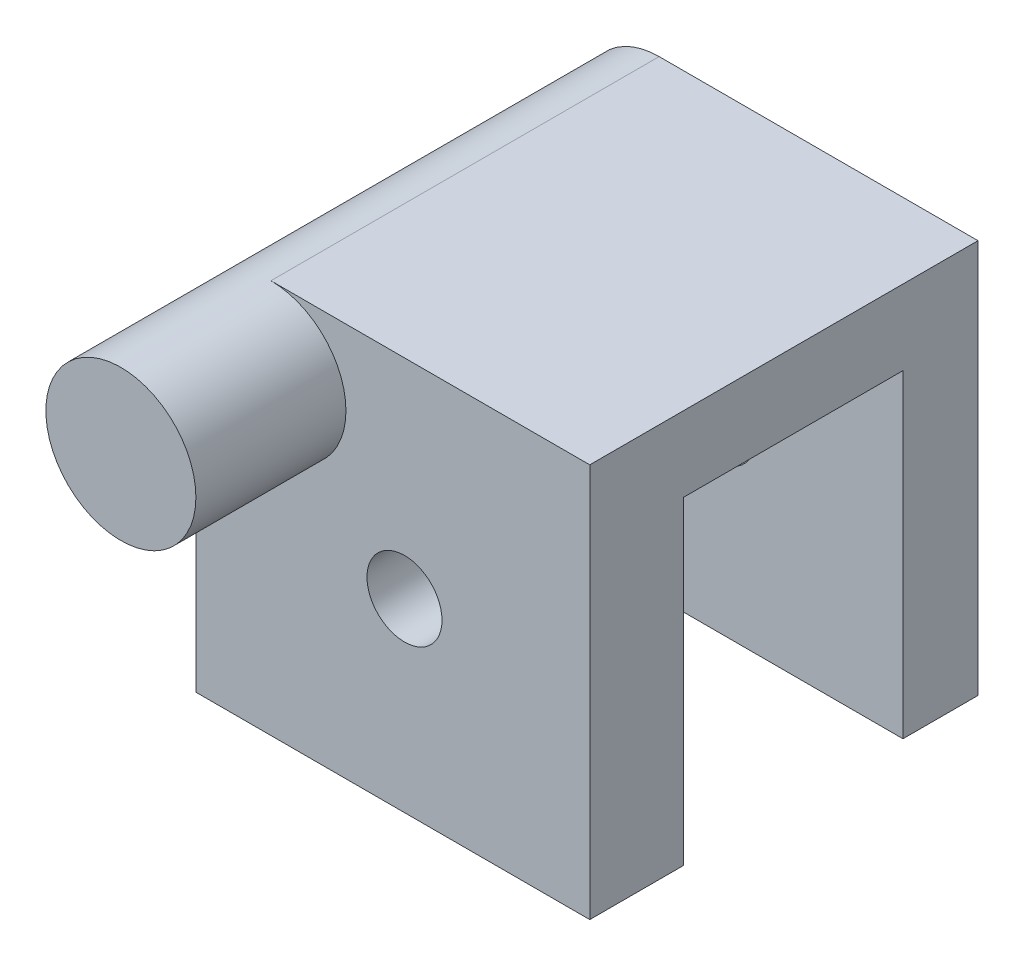
ISO-10303-21;
HEADER;
FILE_DESCRIPTION(('STEP AP214'),'2;1');
FILE_NAME('part.step','',(''),(''),'','','');
FILE_SCHEMA(('AUTOMOTIVE_DESIGN { 1 0 10303 214 1 1 1 1 }'));
ENDSEC;
DATA;
#1=APPLICATION_CONTEXT('core data for automotive mechanical design processes');
#2=APPLICATION_PROTOCOL_DEFINITION('international standard','automotive_design',2000,#1);
#3=PRODUCT_CONTEXT('',#1,'mechanical');
#4=PRODUCT('Part','Part','',(#3));
#5=PRODUCT_RELATED_PRODUCT_CATEGORY('part','',(#4));
#6=PRODUCT_DEFINITION_FORMATION('','',#4);
#7=PRODUCT_DEFINITION_CONTEXT('part definition',#1,'design');
#8=PRODUCT_DEFINITION('design','',#6,#7);
#9=PRODUCT_DEFINITION_SHAPE('','',#8);
#10=(LENGTH_UNIT() NAMED_UNIT(*) SI_UNIT(.MILLI.,.METRE.));
#11=(NAMED_UNIT(*) PLANE_ANGLE_UNIT() SI_UNIT($,.RADIAN.));
#12=(NAMED_UNIT(*) SI_UNIT($,.STERADIAN.) SOLID_ANGLE_UNIT());
#13=UNCERTAINTY_MEASURE_WITH_UNIT(LENGTH_MEASURE(1.E-05),#10,'distance_accuracy_value','');
#14=(GEOMETRIC_REPRESENTATION_CONTEXT(3) GLOBAL_UNCERTAINTY_ASSIGNED_CONTEXT((#13)) GLOBAL_UNIT_ASSIGNED_CONTEXT((#10,
#11,#12)) REPRESENTATION_CONTEXT('',''));
#15=CARTESIAN_POINT('',(0.,0.,0.));
#16=DIRECTION('',(0.,0.,1.));
#17=DIRECTION('',(1.,0.,0.));
#18=AXIS2_PLACEMENT_3D('',#15,#16,#17);
#19=CARTESIAN_POINT('',(-46.,0.,-41.398484809835));
#20=DIRECTION('',(1.,0.,0.));
#21=DIRECTION('',(0.,0.,-1.));
#22=AXIS2_PLACEMENT_3D('',#19,#20,#21);
#23=PLANE('',#22);
#24=DIRECTION('',(0.,0.,1.));
#25=VECTOR('',#24,1.);
#26=CARTESIAN_POINT('',(-46.,-21.,-41.398484809835));
#27=LINE('',#26,#25);
#28=CARTESIAN_POINT('',(-46.,-21.,-11.7));
#29=VERTEX_POINT('',#28);
#30=CARTESIAN_POINT('',(-46.,-21.,0.));
#31=VERTEX_POINT('',#30);
#32=EDGE_CURVE('E234',#29,#31,#27,.T.);
#33=ORIENTED_EDGE('',*,*,#32,.F.);
#34=DIRECTION('',(0.,1.,0.));
#35=VECTOR('',#34,1.);
#36=CARTESIAN_POINT('',(-46.,0.,-11.7));
#37=LINE('',#36,#35);
#38=CARTESIAN_POINT('',(-46.,-8.00000000000001,-11.7));
#39=VERTEX_POINT('',#38);
#40=EDGE_CURVE('E83',#29,#39,#37,.T.);
#41=ORIENTED_EDGE('',*,*,#40,.T.);
#42=DIRECTION('',(0.,0.,1.));
#43=VECTOR('',#42,1.);
#44=CARTESIAN_POINT('',(-46.,-8.00000000000001,-41.398484809835));
#45=LINE('',#44,#43);
#46=CARTESIAN_POINT('',(-46.,-8.00000000000001,0.));
#47=VERTEX_POINT('',#46);
#48=EDGE_CURVE('E232',#39,#47,#45,.T.);
#49=ORIENTED_EDGE('',*,*,#48,.T.);
#50=DIRECTION('',(0.,-1.,0.));
#51=VECTOR('',#50,1.);
#52=CARTESIAN_POINT('',(-46.,0.,0.));
#53=LINE('',#52,#51);
#54=EDGE_CURVE('E214',#47,#31,#53,.T.);
#55=ORIENTED_EDGE('',*,*,#54,.T.);
#56=EDGE_LOOP('',(#33,#41,#49,#55));
#57=FACE_BOUND('',#56,.T.);
#58=ADVANCED_FACE('F68',(#57),#23,.T.);
#59=CARTESIAN_POINT('',(0.,-4.,-41.398484809835));
#60=DIRECTION('',(0.,1.,0.));
#61=DIRECTION('',(0.,0.,1.));
#62=AXIS2_PLACEMENT_3D('',#59,#60,#61);
#63=PLANE('',#62);
#64=DIRECTION('',(-1.,0.,0.));
#65=VECTOR('',#64,1.);
#66=CARTESIAN_POINT('',(0.,-4.,-11.7));
#67=LINE('',#66,#65);
#68=CARTESIAN_POINT('',(-29.,-4.,-11.7));
#69=VERTEX_POINT('',#68);
#70=CARTESIAN_POINT('',(-42.,-4.,-11.7));
#71=VERTEX_POINT('',#70);
#72=EDGE_CURVE('E91',#69,#71,#67,.T.);
#73=ORIENTED_EDGE('',*,*,#72,.F.);
#74=DIRECTION('',(0.,0.,1.));
#75=VECTOR('',#74,1.);
#76=CARTESIAN_POINT('',(-29.,-4.,-41.398484809835));
#77=LINE('',#76,#75);
#78=CARTESIAN_POINT('',(-29.,-4.,0.));
#79=VERTEX_POINT('',#78);
#80=EDGE_CURVE('E236',#69,#79,#77,.T.);
#81=ORIENTED_EDGE('',*,*,#80,.T.);
#82=DIRECTION('',(1.,0.,0.));
#83=VECTOR('',#82,1.);
#84=CARTESIAN_POINT('',(0.,-4.,0.));
#85=LINE('',#84,#83);
#86=CARTESIAN_POINT('',(-42.,-4.,0.));
#87=VERTEX_POINT('',#86);
#88=EDGE_CURVE('E207',#87,#79,#85,.T.);
#89=ORIENTED_EDGE('',*,*,#88,.F.);
#90=DIRECTION('',(0.,0.,1.));
#91=VECTOR('',#90,1.);
#92=CARTESIAN_POINT('',(-42.,-4.,-41.398484809835));
#93=LINE('',#92,#91);
#94=EDGE_CURVE('E231',#71,#87,#93,.T.);
#95=ORIENTED_EDGE('',*,*,#94,.F.);
#96=EDGE_LOOP('',(#73,#81,#89,#95));
#97=FACE_BOUND('',#96,.T.);
#98=ADVANCED_FACE('F264',(#97),#63,.F.);
#99=CARTESIAN_POINT('',(-46.,-4.,-41.398484809835));
#100=DIRECTION('',(0.,0.,1.));
#101=DIRECTION('',(1.,0.,0.));
#102=AXIS2_PLACEMENT_3D('',#99,#100,#101);
#103=CYLINDRICAL_SURFACE('',#102,4.00000000000001);
#104=ORIENTED_EDGE('',*,*,#94,.T.);
#105=CARTESIAN_POINT('',(-46.,-4.,0.));
#106=DIRECTION('',(0.,0.,1.));
#107=DIRECTION('',(1.,0.,0.));
#108=AXIS2_PLACEMENT_3D('',#105,#106,#107);
#109=CIRCLE('',#108,4.00000000000001);
#110=EDGE_CURVE('E188',#47,#87,#109,.T.);
#111=ORIENTED_EDGE('',*,*,#110,.F.);
#112=ORIENTED_EDGE('',*,*,#48,.F.);
#113=CARTESIAN_POINT('',(-46.,-4.,-11.7));
#114=DIRECTION('',(0.,0.,-1.));
#115=DIRECTION('',(0.,1.,0.));
#116=AXIS2_PLACEMENT_3D('',#113,#114,#115);
#117=CIRCLE('',#116,4.00000000000001);
#118=EDGE_CURVE('E228',#39,#71,#117,.F.);
#119=ORIENTED_EDGE('',*,*,#118,.T.);
#120=EDGE_LOOP('',(#104,#111,#112,#119));
#121=FACE_BOUND('',#120,.T.);
#122=ADVANCED_FACE('F266',(#121),#103,.T.);
#123=DIRECTION('',(0.,0.,1.));
#124=VECTOR('',#123,1.);
#125=CARTESIAN_POINT('',(-50.,-4.,-41.398484809835));
#126=LINE('',#125,#124);
#127=CARTESIAN_POINT('',(-50.,-4.,-15.7));
#128=VERTEX_POINT('',#127);
#129=CARTESIAN_POINT('',(-50.,-4.,5.));
#130=VERTEX_POINT('',#129);
#131=EDGE_CURVE('E227',#128,#130,#126,.T.);
#132=ORIENTED_EDGE('',*,*,#131,.T.);
#133=CARTESIAN_POINT('',(-46.,-4.,5.));
#134=DIRECTION('',(0.,0.,1.));
#135=DIRECTION('',(1.,0.,0.));
#136=AXIS2_PLACEMENT_3D('',#133,#134,#135);
#137=CIRCLE('',#136,4.00000000000001);
#138=CARTESIAN_POINT('',(-46.,0.,5.));
#139=VERTEX_POINT('',#138);
#140=EDGE_CURVE('E189',#130,#139,#137,.T.);
#141=ORIENTED_EDGE('',*,*,#140,.T.);
#142=DIRECTION('',(0.,0.,1.));
#143=VECTOR('',#142,1.);
#144=CARTESIAN_POINT('',(-46.,0.,-41.398484809835));
#145=LINE('',#144,#143);
#146=CARTESIAN_POINT('',(-46.,0.,-15.7));
#147=VERTEX_POINT('',#146);
#148=EDGE_CURVE('E12',#147,#139,#145,.T.);
#149=ORIENTED_EDGE('',*,*,#148,.F.);
#150=CARTESIAN_POINT('',(-46.,-4.,-15.7));
#151=DIRECTION('',(0.,0.,-1.));
#152=DIRECTION('',(0.,1.,0.));
#153=AXIS2_PLACEMENT_3D('',#150,#151,#152);
#154=CIRCLE('',#153,4.00000000000001);
#155=EDGE_CURVE('E223',#128,#147,#154,.T.);
#156=ORIENTED_EDGE('',*,*,#155,.F.);
#157=EDGE_LOOP('',(#132,#141,#149,#156));
#158=FACE_BOUND('',#157,.T.);
#159=CARTESIAN_POINT('',(-46.,-4.,13.));
#160=DIRECTION('',(0.,0.,1.));
#161=DIRECTION('',(1.,0.,0.));
#162=AXIS2_PLACEMENT_3D('',#159,#160,#161);
#163=CIRCLE('',#162,4.00000000000001);
#164=CARTESIAN_POINT('',(-42.,-4.,13.));
#165=VERTEX_POINT('',#164);
#166=EDGE_CURVE('E183',#165,#165,#163,.T.);
#167=ORIENTED_EDGE('',*,*,#166,.F.);
#168=EDGE_LOOP('',(#167));
#169=FACE_BOUND('',#168,.T.);
#170=ADVANCED_FACE('F70',(#158,#169),#103,.T.);
#171=CARTESIAN_POINT('',(-50.,0.,-41.398484809835));
#172=DIRECTION('',(1.,0.,0.));
#173=DIRECTION('',(0.,0.,-1.));
#174=AXIS2_PLACEMENT_3D('',#171,#172,#173);
#175=PLANE('',#174);
#176=ORIENTED_EDGE('',*,*,#131,.F.);
#177=DIRECTION('',(0.,-1.,0.));
#178=VECTOR('',#177,1.);
#179=CARTESIAN_POINT('',(-50.,0.,-15.7));
#180=LINE('',#179,#178);
#181=CARTESIAN_POINT('',(-50.,-21.,-15.7));
#182=VERTEX_POINT('',#181);
#183=EDGE_CURVE('E156',#128,#182,#180,.T.);
#184=ORIENTED_EDGE('',*,*,#183,.T.);
#185=DIRECTION('',(0.,0.,1.));
#186=VECTOR('',#185,1.);
#187=CARTESIAN_POINT('',(-50.,-21.,-41.398484809835));
#188=LINE('',#187,#186);
#189=CARTESIAN_POINT('',(-50.,-21.,5.));
#190=VERTEX_POINT('',#189);
#191=EDGE_CURVE('E152',#182,#190,#188,.T.);
#192=ORIENTED_EDGE('',*,*,#191,.T.);
#193=DIRECTION('',(0.,1.,0.));
#194=VECTOR('',#193,1.);
#195=CARTESIAN_POINT('',(-50.,0.,5.));
#196=LINE('',#195,#194);
#197=EDGE_CURVE('E192',#190,#130,#196,.T.);
#198=ORIENTED_EDGE('',*,*,#197,.T.);
#199=EDGE_LOOP('',(#176,#184,#192,#198));
#200=FACE_BOUND('',#199,.T.);
#201=ADVANCED_FACE('F254',(#200),#175,.F.);
#202=CARTESIAN_POINT('',(0.,-21.,-41.398484809835));
#203=DIRECTION('',(0.,1.,0.));
#204=DIRECTION('',(-1.,0.,0.));
#205=AXIS2_PLACEMENT_3D('',#202,#203,#204);
#206=PLANE('',#205);
#207=ORIENTED_EDGE('',*,*,#191,.F.);
#208=DIRECTION('',(1.,0.,0.));
#209=VECTOR('',#208,1.);
#210=CARTESIAN_POINT('',(0.,-21.,-15.7));
#211=LINE('',#210,#209);
#212=CARTESIAN_POINT('',(-29.,-21.,-15.7));
#213=VERTEX_POINT('',#212);
#214=EDGE_CURVE('E144',#182,#213,#211,.T.);
#215=ORIENTED_EDGE('',*,*,#214,.T.);
#216=DIRECTION('',(0.,0.,-1.));
#217=VECTOR('',#216,1.);
#218=CARTESIAN_POINT('',(-29.,-21.,12.3416305603426));
#219=LINE('',#218,#217);
#220=CARTESIAN_POINT('',(-29.,-21.,-11.7));
#221=VERTEX_POINT('',#220);
#222=EDGE_CURVE('E149',#221,#213,#219,.T.);
#223=ORIENTED_EDGE('',*,*,#222,.F.);
#224=DIRECTION('',(1.,0.,0.));
#225=VECTOR('',#224,1.);
#226=CARTESIAN_POINT('',(-46.,-21.,-11.7));
#227=LINE('',#226,#225);
#228=EDGE_CURVE('E173',#29,#221,#227,.T.);
#229=ORIENTED_EDGE('',*,*,#228,.F.);
#230=ORIENTED_EDGE('',*,*,#32,.T.);
#231=DIRECTION('',(1.,0.,0.));
#232=VECTOR('',#231,1.);
#233=CARTESIAN_POINT('',(0.,-21.,0.));
#234=LINE('',#233,#232);
#235=CARTESIAN_POINT('',(-28.9999999999999,-21.,0.));
#236=VERTEX_POINT('',#235);
#237=EDGE_CURVE('E181',#31,#236,#234,.T.);
#238=ORIENTED_EDGE('',*,*,#237,.T.);
#239=DIRECTION('',(0.,0.,1.));
#240=VECTOR('',#239,1.);
#241=CARTESIAN_POINT('',(-28.9999999999999,-21.,-24.0416305603426));
#242=LINE('',#241,#240);
#243=CARTESIAN_POINT('',(-28.9999999999999,-21.,5.00000000000012));
#244=VERTEX_POINT('',#243);
#245=EDGE_CURVE('E177',#236,#244,#242,.T.);
#246=ORIENTED_EDGE('',*,*,#245,.T.);
#247=DIRECTION('',(-1.,0.,0.));
#248=VECTOR('',#247,1.);
#249=CARTESIAN_POINT('',(0.,-21.,5.));
#250=LINE('',#249,#248);
#251=EDGE_CURVE('E196',#244,#190,#250,.T.);
#252=ORIENTED_EDGE('',*,*,#251,.T.);
#253=EDGE_LOOP('',(#207,#215,#223,#229,#230,#238,#246,#252));
#254=FACE_BOUND('',#253,.T.);
#255=ADVANCED_FACE('F146',(#254),#206,.F.);
#256=CARTESIAN_POINT('',(-29.,0.,-41.398484809835));
#257=DIRECTION('',(1.,0.,0.));
#258=DIRECTION('',(0.,0.,-1.));
#259=AXIS2_PLACEMENT_3D('',#256,#257,#258);
#260=PLANE('',#259);
#261=ORIENTED_EDGE('',*,*,#80,.F.);
#262=DIRECTION('',(0.,-1.,0.));
#263=VECTOR('',#262,1.);
#264=CARTESIAN_POINT('',(-29.,-3.99999999999999,-11.7));
#265=LINE('',#264,#263);
#266=EDGE_CURVE('E171',#69,#221,#265,.T.);
#267=ORIENTED_EDGE('',*,*,#266,.T.);
#268=ORIENTED_EDGE('',*,*,#222,.T.);
#269=DIRECTION('',(0.,-1.,0.));
#270=VECTOR('',#269,1.);
#271=CARTESIAN_POINT('',(-29.,0.,-15.7));
#272=LINE('',#271,#270);
#273=CARTESIAN_POINT('',(-29.,0.,-15.7));
#274=VERTEX_POINT('',#273);
#275=EDGE_CURVE('E157',#274,#213,#272,.T.);
#276=ORIENTED_EDGE('',*,*,#275,.F.);
#277=DIRECTION('',(0.,0.,1.));
#278=VECTOR('',#277,1.);
#279=CARTESIAN_POINT('',(-29.,0.,-41.398484809835));
#280=LINE('',#279,#278);
#281=CARTESIAN_POINT('',(-29.,0.,5.));
#282=VERTEX_POINT('',#281);
#283=EDGE_CURVE('E76',#274,#282,#280,.T.);
#284=ORIENTED_EDGE('',*,*,#283,.T.);
#285=DIRECTION('',(0.,1.,0.));
#286=VECTOR('',#285,1.);
#287=CARTESIAN_POINT('',(-29.,0.,5.));
#288=LINE('',#287,#286);
#289=EDGE_CURVE('E198',#244,#282,#288,.T.);
#290=ORIENTED_EDGE('',*,*,#289,.F.);
#291=ORIENTED_EDGE('',*,*,#245,.F.);
#292=DIRECTION('',(0.,-1.,0.));
#293=VECTOR('',#292,1.);
#294=CARTESIAN_POINT('',(-29.,0.,0.));
#295=LINE('',#294,#293);
#296=EDGE_CURVE('E180',#79,#236,#295,.T.);
#297=ORIENTED_EDGE('',*,*,#296,.F.);
#298=EDGE_LOOP('',(#261,#267,#268,#276,#284,#290,#291,#297));
#299=FACE_BOUND('',#298,.T.);
#300=ADVANCED_FACE('F169',(#299),#260,.T.);
#301=CARTESIAN_POINT('',(0.,0.,-41.398484809835));
#302=DIRECTION('',(0.,1.,0.));
#303=DIRECTION('',(-1.,0.,0.));
#304=AXIS2_PLACEMENT_3D('',#301,#302,#303);
#305=PLANE('',#304);
#306=ORIENTED_EDGE('',*,*,#283,.F.);
#307=DIRECTION('',(1.,0.,0.));
#308=VECTOR('',#307,1.);
#309=CARTESIAN_POINT('',(0.,0.,-15.7));
#310=LINE('',#309,#308);
#311=EDGE_CURVE('E165',#147,#274,#310,.T.);
#312=ORIENTED_EDGE('',*,*,#311,.F.);
#313=ORIENTED_EDGE('',*,*,#148,.T.);
#314=DIRECTION('',(-1.,0.,0.));
#315=VECTOR('',#314,1.);
#316=CARTESIAN_POINT('',(0.,0.,5.));
#317=LINE('',#316,#315);
#318=EDGE_CURVE('E201',#282,#139,#317,.T.);
#319=ORIENTED_EDGE('',*,*,#318,.F.);
#320=EDGE_LOOP('',(#306,#312,#313,#319));
#321=FACE_BOUND('',#320,.T.);
#322=ADVANCED_FACE('F256',(#321),#305,.T.);
#323=CARTESIAN_POINT('',(-46.,-4.,-11.7));
#324=DIRECTION('',(0.,0.,-1.));
#325=DIRECTION('',(0.,1.,0.));
#326=AXIS2_PLACEMENT_3D('',#323,#324,#325);
#327=PLANE('',#326);
#328=ORIENTED_EDGE('',*,*,#266,.F.);
#329=ORIENTED_EDGE('',*,*,#72,.T.);
#330=ORIENTED_EDGE('',*,*,#118,.F.);
#331=ORIENTED_EDGE('',*,*,#40,.F.);
#332=ORIENTED_EDGE('',*,*,#228,.T.);
#333=EDGE_LOOP('',(#328,#329,#330,#331,#332));
#334=FACE_BOUND('',#333,.T.);
#335=CARTESIAN_POINT('',(-38.8786796564403,-11.1213203435596,-11.7));
#336=DIRECTION('',(0.,0.,-1.));
#337=DIRECTION('',(0.,1.,0.));
#338=AXIS2_PLACEMENT_3D('',#335,#336,#337);
#339=CIRCLE('',#338,2.);
#340=CARTESIAN_POINT('',(-36.8786796564403,-11.1213203435596,-11.7));
#341=VERTEX_POINT('',#340);
#342=EDGE_CURVE('E217',#341,#341,#339,.T.);
#343=ORIENTED_EDGE('',*,*,#342,.T.);
#344=EDGE_LOOP('',(#343));
#345=FACE_BOUND('',#344,.T.);
#346=ADVANCED_FACE('F268',(#334,#345),#327,.F.);
#347=CARTESIAN_POINT('',(-46.,-4.,-15.7));
#348=DIRECTION('',(0.,0.,-1.));
#349=DIRECTION('',(0.,1.,0.));
#350=AXIS2_PLACEMENT_3D('',#347,#348,#349);
#351=PLANE('',#350);
#352=ORIENTED_EDGE('',*,*,#275,.T.);
#353=ORIENTED_EDGE('',*,*,#214,.F.);
#354=ORIENTED_EDGE('',*,*,#183,.F.);
#355=ORIENTED_EDGE('',*,*,#155,.T.);
#356=ORIENTED_EDGE('',*,*,#311,.T.);
#357=EDGE_LOOP('',(#352,#353,#354,#355,#356));
#358=FACE_BOUND('',#357,.T.);
#359=CARTESIAN_POINT('',(-38.8786796564403,-11.1213203435596,-15.7));
#360=DIRECTION('',(0.,0.,-1.));
#361=DIRECTION('',(0.,1.,0.));
#362=AXIS2_PLACEMENT_3D('',#359,#360,#361);
#363=CIRCLE('',#362,2.);
#364=CARTESIAN_POINT('',(-36.8786796564403,-11.1213203435596,-15.7));
#365=VERTEX_POINT('',#364);
#366=EDGE_CURVE('E167',#365,#365,#363,.T.);
#367=ORIENTED_EDGE('',*,*,#366,.F.);
#368=EDGE_LOOP('',(#367));
#369=FACE_BOUND('',#368,.T.);
#370=ADVANCED_FACE('F161',(#358,#369),#351,.T.);
#371=CARTESIAN_POINT('',(-38.8786796564403,-11.1213203435596,-15.7));
#372=DIRECTION('',(0.,0.,1.));
#373=DIRECTION('',(1.,0.,0.));
#374=AXIS2_PLACEMENT_3D('',#371,#372,#373);
#375=CYLINDRICAL_SURFACE('',#374,2.);
#376=CARTESIAN_POINT('',(-36.8786796564403,-11.1213203435596,-15.7));
#377=CARTESIAN_POINT('',(-36.8786796564403,-11.1213203435596,-15.6583333333333));
#378=CARTESIAN_POINT('',(-36.8786796564403,-11.1213203435596,-15.6166666666667));
#379=CARTESIAN_POINT('',(-36.8786796564403,-11.1213203435596,-15.5333333333333));
#380=CARTESIAN_POINT('',(-36.8786796564403,-11.1213203435596,-15.4916666666667));
#381=CARTESIAN_POINT('',(-36.8786796564403,-11.1213203435596,-15.4083333333333));
#382=CARTESIAN_POINT('',(-36.8786796564403,-11.1213203435596,-15.3666666666667));
#383=CARTESIAN_POINT('',(-36.8786796564403,-11.1213203435596,-15.2833333333333));
#384=CARTESIAN_POINT('',(-36.8786796564403,-11.1213203435596,-15.2416666666667));
#385=CARTESIAN_POINT('',(-36.8786796564403,-11.1213203435596,-15.1583333333333));
#386=CARTESIAN_POINT('',(-36.8786796564403,-11.1213203435596,-15.1166666666667));
#387=CARTESIAN_POINT('',(-36.8786796564403,-11.1213203435596,-15.0333333333333));
#388=CARTESIAN_POINT('',(-36.8786796564403,-11.1213203435596,-14.9916666666667));
#389=CARTESIAN_POINT('',(-36.8786796564403,-11.1213203435596,-14.9083333333333));
#390=CARTESIAN_POINT('',(-36.8786796564403,-11.1213203435596,-14.8666666666667));
#391=CARTESIAN_POINT('',(-36.8786796564403,-11.1213203435596,-14.7833333333333));
#392=CARTESIAN_POINT('',(-36.8786796564403,-11.1213203435596,-14.7416666666667));
#393=CARTESIAN_POINT('',(-36.8786796564403,-11.1213203435596,-14.6583333333333));
#394=CARTESIAN_POINT('',(-36.8786796564403,-11.1213203435596,-14.6166666666667));
#395=CARTESIAN_POINT('',(-36.8786796564403,-11.1213203435596,-14.5333333333333));
#396=CARTESIAN_POINT('',(-36.8786796564403,-11.1213203435596,-14.4916666666667));
#397=CARTESIAN_POINT('',(-36.8786796564403,-11.1213203435596,-14.4083333333333));
#398=CARTESIAN_POINT('',(-36.8786796564403,-11.1213203435596,-14.3666666666667));
#399=CARTESIAN_POINT('',(-36.8786796564403,-11.1213203435596,-14.2833333333333));
#400=CARTESIAN_POINT('',(-36.8786796564403,-11.1213203435596,-14.2416666666667));
#401=CARTESIAN_POINT('',(-36.8786796564403,-11.1213203435596,-14.1583333333333));
#402=CARTESIAN_POINT('',(-36.8786796564403,-11.1213203435596,-14.1166666666667));
#403=CARTESIAN_POINT('',(-36.8786796564403,-11.1213203435596,-14.0333333333333));
#404=CARTESIAN_POINT('',(-36.8786796564403,-11.1213203435596,-13.9916666666667));
#405=CARTESIAN_POINT('',(-36.8786796564403,-11.1213203435596,-13.9083333333333));
#406=CARTESIAN_POINT('',(-36.8786796564403,-11.1213203435596,-13.8666666666667));
#407=CARTESIAN_POINT('',(-36.8786796564403,-11.1213203435596,-13.7833333333333));
#408=CARTESIAN_POINT('',(-36.8786796564403,-11.1213203435596,-13.7416666666667));
#409=CARTESIAN_POINT('',(-36.8786796564403,-11.1213203435596,-13.6583333333333));
#410=CARTESIAN_POINT('',(-36.8786796564403,-11.1213203435596,-13.6166666666667));
#411=CARTESIAN_POINT('',(-36.8786796564403,-11.1213203435596,-13.5333333333333));
#412=CARTESIAN_POINT('',(-36.8786796564403,-11.1213203435596,-13.4916666666667));
#413=CARTESIAN_POINT('',(-36.8786796564403,-11.1213203435596,-13.4083333333333));
#414=CARTESIAN_POINT('',(-36.8786796564403,-11.1213203435596,-13.3666666666667));
#415=CARTESIAN_POINT('',(-36.8786796564403,-11.1213203435596,-13.2833333333333));
#416=CARTESIAN_POINT('',(-36.8786796564403,-11.1213203435596,-13.2416666666667));
#417=CARTESIAN_POINT('',(-36.8786796564403,-11.1213203435596,-13.1583333333333));
#418=CARTESIAN_POINT('',(-36.8786796564403,-11.1213203435596,-13.1166666666667));
#419=CARTESIAN_POINT('',(-36.8786796564403,-11.1213203435596,-13.0333333333333));
#420=CARTESIAN_POINT('',(-36.8786796564403,-11.1213203435596,-12.9916666666667));
#421=CARTESIAN_POINT('',(-36.8786796564403,-11.1213203435596,-12.9083333333333));
#422=CARTESIAN_POINT('',(-36.8786796564403,-11.1213203435596,-12.8666666666667));
#423=CARTESIAN_POINT('',(-36.8786796564403,-11.1213203435596,-12.7833333333333));
#424=CARTESIAN_POINT('',(-36.8786796564403,-11.1213203435596,-12.7416666666667));
#425=CARTESIAN_POINT('',(-36.8786796564403,-11.1213203435596,-12.6583333333333));
#426=CARTESIAN_POINT('',(-36.8786796564403,-11.1213203435596,-12.6166666666667));
#427=CARTESIAN_POINT('',(-36.8786796564403,-11.1213203435596,-12.5333333333333));
#428=CARTESIAN_POINT('',(-36.8786796564403,-11.1213203435596,-12.4916666666667));
#429=CARTESIAN_POINT('',(-36.8786796564403,-11.1213203435596,-12.4083333333333));
#430=CARTESIAN_POINT('',(-36.8786796564403,-11.1213203435596,-12.3666666666667));
#431=CARTESIAN_POINT('',(-36.8786796564403,-11.1213203435596,-12.2833333333333));
#432=CARTESIAN_POINT('',(-36.8786796564403,-11.1213203435596,-12.2416666666667));
#433=CARTESIAN_POINT('',(-36.8786796564403,-11.1213203435596,-12.1583333333333));
#434=CARTESIAN_POINT('',(-36.8786796564403,-11.1213203435596,-12.1166666666667));
#435=CARTESIAN_POINT('',(-36.8786796564403,-11.1213203435596,-12.0333333333333));
#436=CARTESIAN_POINT('',(-36.8786796564403,-11.1213203435596,-11.9916666666667));
#437=CARTESIAN_POINT('',(-36.8786796564403,-11.1213203435596,-11.9083333333333));
#438=CARTESIAN_POINT('',(-36.8786796564403,-11.1213203435596,-11.8666666666667));
#439=CARTESIAN_POINT('',(-36.8786796564403,-11.1213203435596,-11.7833333333333));
#440=CARTESIAN_POINT('',(-36.8786796564403,-11.1213203435596,-11.7416666666667));
#441=CARTESIAN_POINT('',(-36.8786796564403,-11.1213203435596,-11.7));
#442=B_SPLINE_CURVE_WITH_KNOTS('',3,(#376,#377,#378,#379,#380,#381,#382,#383,#384,#385,#386,
#387,#388,#389,#390,#391,#392,#393,#394,#395,#396,#397,#398,#399,#400,#401,#402,#403,#404,#405,
#406,#407,#408,#409,#410,#411,#412,#413,#414,#415,#416,#417,#418,#419,#420,#421,#422,#423,#424,
#425,#426,#427,#428,#429,#430,#431,#432,#433,#434,#435,#436,#437,#438,#439,#440,#441),
.UNSPECIFIED.,.F.,.F.,(4,2,2,2,2,2,2,2,2,2,2,2,2,2,2,2,2,2,2,2,2,2,2,2,2,2,2,2,2,2,2,2,4),(0.,
0.124999999999998,0.249999999999999,0.374999999999999,0.499999999999999,0.624999999999999,
0.749999999999999,0.874999999999999,0.999999999999997,1.125,1.25,1.375,1.5,1.625,1.75,1.875,2.,
2.125,2.25,2.375,2.5,2.625,2.75,2.875,3.,3.125,3.25,3.375,3.5,3.625,3.75,3.875,4.),.UNSPECIFIED.);
#443=EDGE_CURVE('BSEAM333',#365,#341,#442,.T.);
#444=ORIENTED_EDGE('',*,*,#366,.T.);
#445=ORIENTED_EDGE('',*,*,#342,.F.);
#446=ORIENTED_EDGE('',*,*,#443,.T.);
#447=ORIENTED_EDGE('',*,*,#443,.F.);
#448=EDGE_LOOP('',(#444,#446,#445,#447));
#449=FACE_BOUND('',#448,.T.);
#450=ADVANCED_FACE('F333',(#449),#375,.F.);
#451=CARTESIAN_POINT('',(0.,0.,0.));
#452=DIRECTION('',(0.,0.,1.));
#453=DIRECTION('',(1.,0.,0.));
#454=AXIS2_PLACEMENT_3D('',#451,#452,#453);
#455=PLANE('',#454);
#456=ORIENTED_EDGE('',*,*,#54,.F.);
#457=ORIENTED_EDGE('',*,*,#110,.T.);
#458=ORIENTED_EDGE('',*,*,#88,.T.);
#459=ORIENTED_EDGE('',*,*,#296,.T.);
#460=ORIENTED_EDGE('',*,*,#237,.F.);
#461=EDGE_LOOP('',(#456,#457,#458,#459,#460));
#462=FACE_BOUND('',#461,.T.);
#463=CARTESIAN_POINT('',(-38.8786796564403,-11.1213203435596,0.));
#464=DIRECTION('',(0.,0.,1.));
#465=DIRECTION('',(1.,0.,0.));
#466=AXIS2_PLACEMENT_3D('',#463,#464,#465);
#467=CIRCLE('',#466,2.);
#468=CARTESIAN_POINT('',(-36.8786796564403,-11.1213203435596,0.));
#469=VERTEX_POINT('',#468);
#470=EDGE_CURVE('E193',#469,#469,#467,.T.);
#471=ORIENTED_EDGE('',*,*,#470,.T.);
#472=EDGE_LOOP('',(#471));
#473=FACE_BOUND('',#472,.T.);
#474=ADVANCED_FACE('F262',(#462,#473),#455,.F.);
#475=CARTESIAN_POINT('',(-38.8786796564403,-11.1213203435596,5.));
#476=DIRECTION('',(0.,0.,-1.));
#477=DIRECTION('',(-1.,0.,0.));
#478=AXIS2_PLACEMENT_3D('',#475,#476,#477);
#479=CYLINDRICAL_SURFACE('',#478,2.);
#480=CARTESIAN_POINT('',(-38.8786796564403,-11.1213203435596,5.));
#481=DIRECTION('',(0.,0.,1.));
#482=DIRECTION('',(1.,0.,0.));
#483=AXIS2_PLACEMENT_3D('',#480,#481,#482);
#484=CIRCLE('',#483,2.);
#485=CARTESIAN_POINT('',(-36.8786796564403,-11.1213203435596,5.));
#486=VERTEX_POINT('',#485);
#487=EDGE_CURVE('E204',#486,#486,#484,.T.);
#488=ORIENTED_EDGE('',*,*,#487,.T.);
#489=EDGE_LOOP('',(#488));
#490=FACE_BOUND('',#489,.T.);
#491=ORIENTED_EDGE('',*,*,#470,.F.);
#492=EDGE_LOOP('',(#491));
#493=FACE_BOUND('',#492,.T.);
#494=ADVANCED_FACE('F349',(#490,#493),#479,.F.);
#495=CARTESIAN_POINT('',(0.,0.,5.));
#496=DIRECTION('',(0.,0.,1.));
#497=DIRECTION('',(1.,0.,0.));
#498=AXIS2_PLACEMENT_3D('',#495,#496,#497);
#499=PLANE('',#498);
#500=ORIENTED_EDGE('',*,*,#140,.F.);
#501=ORIENTED_EDGE('',*,*,#197,.F.);
#502=ORIENTED_EDGE('',*,*,#251,.F.);
#503=ORIENTED_EDGE('',*,*,#289,.T.);
#504=ORIENTED_EDGE('',*,*,#318,.T.);
#505=EDGE_LOOP('',(#500,#501,#502,#503,#504));
#506=FACE_BOUND('',#505,.T.);
#507=ORIENTED_EDGE('',*,*,#487,.F.);
#508=EDGE_LOOP('',(#507));
#509=FACE_BOUND('',#508,.T.);
#510=ADVANCED_FACE('F250',(#506,#509),#499,.T.);
#511=CARTESIAN_POINT('',(-46.,-4.,13.));
#512=DIRECTION('',(0.,0.,1.));
#513=DIRECTION('',(1.,0.,0.));
#514=AXIS2_PLACEMENT_3D('',#511,#512,#513);
#515=PLANE('',#514);
#516=ORIENTED_EDGE('',*,*,#166,.T.);
#517=EDGE_LOOP('',(#516));
#518=FACE_BOUND('',#517,.T.);
#519=ADVANCED_FACE('F364',(#518),#515,.T.);
#520=CLOSED_SHELL('',(#58,#98,#122,#170,#201,#255,#300,#322,#346,#370,#450,#474,#494,#510,#519));
#521=MANIFOLD_SOLID_BREP('B2',#520);
#522=ADVANCED_BREP_SHAPE_REPRESENTATION('',(#18,#521),#14);
#523=SHAPE_DEFINITION_REPRESENTATION(#9,#522);
ENDSEC;
END-ISO-10303-21;
